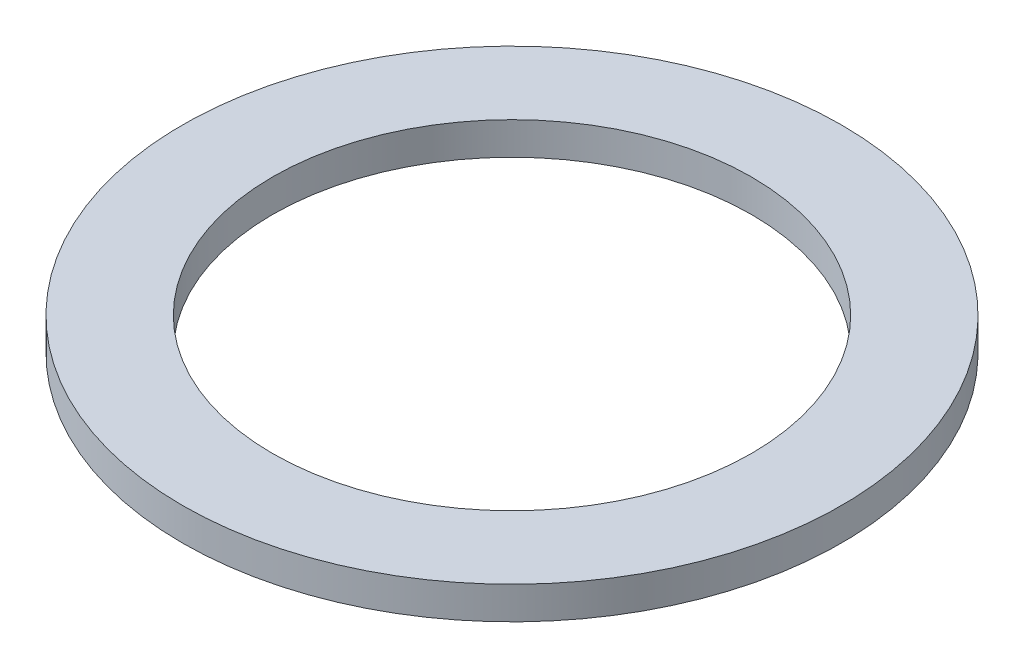
ISO-10303-21;
HEADER;
FILE_DESCRIPTION(('STEP AP214'),'2;1');
FILE_NAME('part.step','',(''),(''),'','','');
FILE_SCHEMA(('AUTOMOTIVE_DESIGN { 1 0 10303 214 1 1 1 1 }'));
ENDSEC;
DATA;
#1=APPLICATION_CONTEXT('core data for automotive mechanical design processes');
#2=APPLICATION_PROTOCOL_DEFINITION('international standard','automotive_design',2000,#1);
#3=PRODUCT_CONTEXT('',#1,'mechanical');
#4=PRODUCT('Part','Part','',(#3));
#5=PRODUCT_RELATED_PRODUCT_CATEGORY('part','',(#4));
#6=PRODUCT_DEFINITION_FORMATION('','',#4);
#7=PRODUCT_DEFINITION_CONTEXT('part definition',#1,'design');
#8=PRODUCT_DEFINITION('design','',#6,#7);
#9=PRODUCT_DEFINITION_SHAPE('','',#8);
#10=(LENGTH_UNIT() NAMED_UNIT(*) SI_UNIT(.MILLI.,.METRE.));
#11=(NAMED_UNIT(*) PLANE_ANGLE_UNIT() SI_UNIT($,.RADIAN.));
#12=(NAMED_UNIT(*) SI_UNIT($,.STERADIAN.) SOLID_ANGLE_UNIT());
#13=UNCERTAINTY_MEASURE_WITH_UNIT(LENGTH_MEASURE(1.E-05),#10,'distance_accuracy_value','');
#14=(GEOMETRIC_REPRESENTATION_CONTEXT(3) GLOBAL_UNCERTAINTY_ASSIGNED_CONTEXT((#13)) GLOBAL_UNIT_ASSIGNED_CONTEXT((#10,
#11,#12)) REPRESENTATION_CONTEXT('',''));
#15=CARTESIAN_POINT('',(0.,0.,0.));
#16=DIRECTION('',(0.,0.,1.));
#17=DIRECTION('',(1.,0.,0.));
#18=AXIS2_PLACEMENT_3D('',#15,#16,#17);
#19=CARTESIAN_POINT('',(0.,0.8636,0.));
#20=DIRECTION('',(0.,-1.,0.));
#21=DIRECTION('',(0.,0.,-1.));
#22=AXIS2_PLACEMENT_3D('',#19,#20,#21);
#23=CYLINDRICAL_SURFACE('',#22,8.7376);
#24=CARTESIAN_POINT('',(0.,0.8636,0.));
#25=DIRECTION('',(0.,1.,0.));
#26=DIRECTION('',(0.,0.,1.));
#27=AXIS2_PLACEMENT_3D('',#24,#25,#26);
#28=CIRCLE('',#27,8.7376);
#29=CARTESIAN_POINT('',(0.,0.8636,8.7376));
#30=VERTEX_POINT('',#29);
#31=EDGE_CURVE('E10',#30,#30,#28,.T.);
#32=ORIENTED_EDGE('',*,*,#31,.F.);
#33=EDGE_LOOP('',(#32));
#34=FACE_BOUND('',#33,.T.);
#35=CARTESIAN_POINT('',(0.,0.,0.));
#36=DIRECTION('',(0.,1.,0.));
#37=DIRECTION('',(0.,0.,1.));
#38=AXIS2_PLACEMENT_3D('',#35,#36,#37);
#39=CIRCLE('',#38,8.7376);
#40=CARTESIAN_POINT('',(0.,0.,8.7376));
#41=VERTEX_POINT('',#40);
#42=EDGE_CURVE('E44',#41,#41,#39,.T.);
#43=ORIENTED_EDGE('',*,*,#42,.T.);
#44=EDGE_LOOP('',(#43));
#45=FACE_BOUND('',#44,.T.);
#46=ADVANCED_FACE('F41',(#34,#45),#23,.T.);
#47=CARTESIAN_POINT('',(0.,0.8636,0.));
#48=DIRECTION('',(0.,1.,0.));
#49=DIRECTION('',(0.,0.,1.));
#50=AXIS2_PLACEMENT_3D('',#47,#48,#49);
#51=PLANE('',#50);
#52=CARTESIAN_POINT('',(0.,0.8636,0.));
#53=DIRECTION('',(0.,1.,0.));
#54=DIRECTION('',(0.,0.,1.));
#55=AXIS2_PLACEMENT_3D('',#52,#53,#54);
#56=CIRCLE('',#55,6.35);
#57=CARTESIAN_POINT('',(0.,0.8636,6.35));
#58=VERTEX_POINT('',#57);
#59=EDGE_CURVE('E56',#58,#58,#56,.T.);
#60=ORIENTED_EDGE('',*,*,#59,.F.);
#61=EDGE_LOOP('',(#60));
#62=FACE_BOUND('',#61,.T.);
#63=ORIENTED_EDGE('',*,*,#31,.T.);
#64=EDGE_LOOP('',(#63));
#65=FACE_BOUND('',#64,.T.);
#66=ADVANCED_FACE('F74',(#62,#65),#51,.T.);
#67=CARTESIAN_POINT('',(0.,0.,0.));
#68=DIRECTION('',(0.,1.,0.));
#69=DIRECTION('',(0.,0.,1.));
#70=AXIS2_PLACEMENT_3D('',#67,#68,#69);
#71=PLANE('',#70);
#72=CARTESIAN_POINT('',(0.,0.,0.));
#73=DIRECTION('',(0.,1.,0.));
#74=DIRECTION('',(0.,0.,1.));
#75=AXIS2_PLACEMENT_3D('',#72,#73,#74);
#76=CIRCLE('',#75,6.35);
#77=CARTESIAN_POINT('',(0.,0.,6.35));
#78=VERTEX_POINT('',#77);
#79=EDGE_CURVE('E54',#78,#78,#76,.T.);
#80=ORIENTED_EDGE('',*,*,#79,.T.);
#81=EDGE_LOOP('',(#80));
#82=FACE_BOUND('',#81,.T.);
#83=ORIENTED_EDGE('',*,*,#42,.F.);
#84=EDGE_LOOP('',(#83));
#85=FACE_BOUND('',#84,.T.);
#86=ADVANCED_FACE('F65',(#82,#85),#71,.F.);
#87=CARTESIAN_POINT('',(0.,0.,0.));
#88=DIRECTION('',(0.,1.,0.));
#89=DIRECTION('',(0.,0.,1.));
#90=AXIS2_PLACEMENT_3D('',#87,#88,#89);
#91=CYLINDRICAL_SURFACE('',#90,6.35);
#92=ORIENTED_EDGE('',*,*,#79,.F.);
#93=EDGE_LOOP('',(#92));
#94=FACE_BOUND('',#93,.T.);
#95=ORIENTED_EDGE('',*,*,#59,.T.);
#96=EDGE_LOOP('',(#95));
#97=FACE_BOUND('',#96,.T.);
#98=ADVANCED_FACE('F68',(#94,#97),#91,.F.);
#99=CLOSED_SHELL('',(#46,#66,#86,#98));
#100=MANIFOLD_SOLID_BREP('B2',#99);
#101=ADVANCED_BREP_SHAPE_REPRESENTATION('',(#18,#100),#14);
#102=SHAPE_DEFINITION_REPRESENTATION(#9,#101);
ENDSEC;
END-ISO-10303-21;
